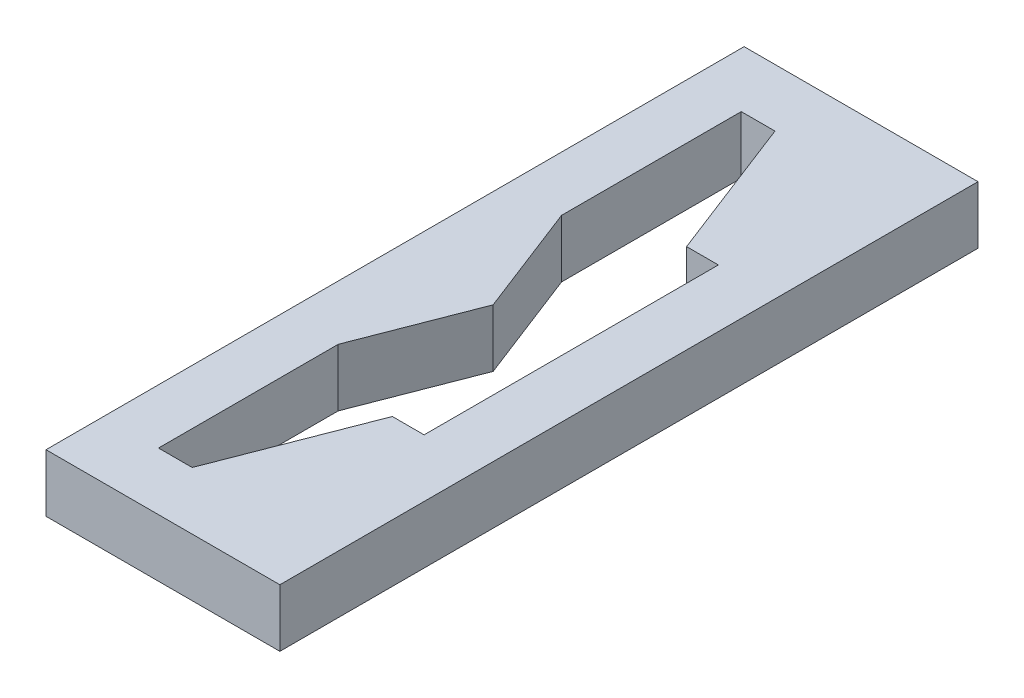
ISO-10303-21;
HEADER;
FILE_DESCRIPTION(('STEP AP214'),'2;1');
FILE_NAME('part.step','',(''),(''),'','','');
FILE_SCHEMA(('AUTOMOTIVE_DESIGN { 1 0 10303 214 1 1 1 1 }'));
ENDSEC;
DATA;
#1=APPLICATION_CONTEXT('core data for automotive mechanical design processes');
#2=APPLICATION_PROTOCOL_DEFINITION('international standard','automotive_design',2000,#1);
#3=PRODUCT_CONTEXT('',#1,'mechanical');
#4=PRODUCT('Part','Part','',(#3));
#5=PRODUCT_RELATED_PRODUCT_CATEGORY('part','',(#4));
#6=PRODUCT_DEFINITION_FORMATION('','',#4);
#7=PRODUCT_DEFINITION_CONTEXT('part definition',#1,'design');
#8=PRODUCT_DEFINITION('design','',#6,#7);
#9=PRODUCT_DEFINITION_SHAPE('','',#8);
#10=(LENGTH_UNIT() NAMED_UNIT(*) SI_UNIT(.MILLI.,.METRE.));
#11=(NAMED_UNIT(*) PLANE_ANGLE_UNIT() SI_UNIT($,.RADIAN.));
#12=(NAMED_UNIT(*) SI_UNIT($,.STERADIAN.) SOLID_ANGLE_UNIT());
#13=UNCERTAINTY_MEASURE_WITH_UNIT(LENGTH_MEASURE(1.E-05),#10,'distance_accuracy_value','');
#14=(GEOMETRIC_REPRESENTATION_CONTEXT(3) GLOBAL_UNCERTAINTY_ASSIGNED_CONTEXT((#13)) GLOBAL_UNIT_ASSIGNED_CONTEXT((#10,
#11,#12)) REPRESENTATION_CONTEXT('',''));
#15=CARTESIAN_POINT('',(0.,0.,0.));
#16=DIRECTION('',(0.,0.,1.));
#17=DIRECTION('',(1.,0.,0.));
#18=AXIS2_PLACEMENT_3D('',#15,#16,#17);
#19=CARTESIAN_POINT('',(0.,2.,0.));
#20=DIRECTION('',(0.,-1.,0.));
#21=DIRECTION('',(0.,0.,-1.));
#22=AXIS2_PLACEMENT_3D('',#19,#20,#21);
#23=PLANE('',#22);
#24=DIRECTION('',(0.,0.,-1.));
#25=VECTOR('',#24,1.);
#26=CARTESIAN_POINT('',(6.10693693693693,2.,22.1));
#27=LINE('',#26,#25);
#28=CARTESIAN_POINT('',(6.10693693693693,2.,22.1));
#29=VERTEX_POINT('',#28);
#30=CARTESIAN_POINT('',(6.10693693693693,2.,-2.1));
#31=VERTEX_POINT('',#30);
#32=EDGE_CURVE('E266',#29,#31,#27,.T.);
#33=ORIENTED_EDGE('',*,*,#32,.T.);
#34=DIRECTION('',(-1.,0.,0.));
#35=VECTOR('',#34,1.);
#36=CARTESIAN_POINT('',(-2.,2.,-2.1));
#37=LINE('',#36,#35);
#38=CARTESIAN_POINT('',(-2.,2.,-2.1));
#39=VERTEX_POINT('',#38);
#40=EDGE_CURVE('E270',#31,#39,#37,.T.);
#41=ORIENTED_EDGE('',*,*,#40,.T.);
#42=DIRECTION('',(0.,0.,1.));
#43=VECTOR('',#42,1.);
#44=CARTESIAN_POINT('',(-2.,2.,22.1));
#45=LINE('',#44,#43);
#46=CARTESIAN_POINT('',(-2.,2.,22.1));
#47=VERTEX_POINT('',#46);
#48=EDGE_CURVE('E274',#39,#47,#45,.T.);
#49=ORIENTED_EDGE('',*,*,#48,.T.);
#50=DIRECTION('',(1.,0.,0.));
#51=VECTOR('',#50,1.);
#52=CARTESIAN_POINT('',(-2.,2.,22.1));
#53=LINE('',#52,#51);
#54=EDGE_CURVE('E277',#47,#29,#53,.T.);
#55=ORIENTED_EDGE('',*,*,#54,.T.);
#56=EDGE_LOOP('',(#33,#41,#49,#55));
#57=FACE_BOUND('',#56,.T.);
#58=DIRECTION('',(0.,0.,1.));
#59=VECTOR('',#58,1.);
#60=CARTESIAN_POINT('',(-0.1,2.,20.1));
#61=LINE('',#60,#59);
#62=CARTESIAN_POINT('',(-0.1,2.,13.871307420652));
#63=VERTEX_POINT('',#62);
#64=CARTESIAN_POINT('',(-0.1,2.,20.1));
#65=VERTEX_POINT('',#64);
#66=EDGE_CURVE('E147',#63,#65,#61,.T.);
#67=ORIENTED_EDGE('',*,*,#66,.F.);
#68=DIRECTION('',(-0.361229766559196,0.,0.932476839257463));
#69=VECTOR('',#68,1.);
#70=CARTESIAN_POINT('',(-0.1,2.,13.871307420652));
#71=LINE('',#70,#69);
#72=CARTESIAN_POINT('',(1.3996956674598,2.,10.));
#73=VERTEX_POINT('',#72);
#74=EDGE_CURVE('E197',#73,#63,#71,.T.);
#75=ORIENTED_EDGE('',*,*,#74,.F.);
#76=DIRECTION('',(0.361229766559196,0.,0.932476839257463));
#77=VECTOR('',#76,1.);
#78=CARTESIAN_POINT('',(-0.1,2.,6.12869257934796));
#79=LINE('',#78,#77);
#80=CARTESIAN_POINT('',(-0.1,2.,6.12869257934796));
#81=VERTEX_POINT('',#80);
#82=EDGE_CURVE('E194',#81,#73,#79,.T.);
#83=ORIENTED_EDGE('',*,*,#82,.F.);
#84=DIRECTION('',(0.,0.,1.));
#85=VECTOR('',#84,1.);
#86=CARTESIAN_POINT('',(-0.1,2.,-0.1));
#87=LINE('',#86,#85);
#88=CARTESIAN_POINT('',(-0.1,2.,-0.1));
#89=VERTEX_POINT('',#88);
#90=EDGE_CURVE('E191',#89,#81,#87,.T.);
#91=ORIENTED_EDGE('',*,*,#90,.F.);
#92=DIRECTION('',(-1.,0.,0.));
#93=VECTOR('',#92,1.);
#94=CARTESIAN_POINT('',(1.0685025307384,2.,-0.1));
#95=LINE('',#94,#93);
#96=CARTESIAN_POINT('',(1.0685025307384,2.,-0.1));
#97=VERTEX_POINT('',#96);
#98=EDGE_CURVE('E188',#97,#89,#95,.T.);
#99=ORIENTED_EDGE('',*,*,#98,.F.);
#100=DIRECTION('',(-0.361229766559197,0.,-0.932476839257463));
#101=VECTOR('',#100,1.);
#102=CARTESIAN_POINT('',(3.00543946767533,2.,4.9));
#103=LINE('',#102,#101);
#104=CARTESIAN_POINT('',(3.00543946767533,2.,4.9));
#105=VERTEX_POINT('',#104);
#106=EDGE_CURVE('E185',#105,#97,#103,.T.);
#107=ORIENTED_EDGE('',*,*,#106,.F.);
#108=DIRECTION('',(-1.,0.,0.));
#109=VECTOR('',#108,1.);
#110=CARTESIAN_POINT('',(4.10693693693694,2.,4.9));
#111=LINE('',#110,#109);
#112=CARTESIAN_POINT('',(4.10693693693694,2.,4.9));
#113=VERTEX_POINT('',#112);
#114=EDGE_CURVE('E182',#113,#105,#111,.T.);
#115=ORIENTED_EDGE('',*,*,#114,.F.);
#116=DIRECTION('',(0.,0.,-1.));
#117=VECTOR('',#116,1.);
#118=CARTESIAN_POINT('',(4.10693693693694,2.,15.1));
#119=LINE('',#118,#117);
#120=CARTESIAN_POINT('',(4.10693693693694,2.,15.1));
#121=VERTEX_POINT('',#120);
#122=EDGE_CURVE('E179',#121,#113,#119,.T.);
#123=ORIENTED_EDGE('',*,*,#122,.F.);
#124=DIRECTION('',(1.,0.,0.));
#125=VECTOR('',#124,1.);
#126=CARTESIAN_POINT('',(4.10693693693694,2.,15.1));
#127=LINE('',#126,#125);
#128=CARTESIAN_POINT('',(3.00543946767533,2.,15.1));
#129=VERTEX_POINT('',#128);
#130=EDGE_CURVE('E174',#129,#121,#127,.T.);
#131=ORIENTED_EDGE('',*,*,#130,.F.);
#132=DIRECTION('',(0.361229766559197,0.,-0.932476839257463));
#133=VECTOR('',#132,1.);
#134=CARTESIAN_POINT('',(3.00543946767533,2.,15.1));
#135=LINE('',#134,#133);
#136=CARTESIAN_POINT('',(1.0685025307384,2.,20.1));
#137=VERTEX_POINT('',#136);
#138=EDGE_CURVE('E170',#137,#129,#135,.T.);
#139=ORIENTED_EDGE('',*,*,#138,.F.);
#140=DIRECTION('',(1.,0.,0.));
#141=VECTOR('',#140,1.);
#142=CARTESIAN_POINT('',(1.0685025307384,2.,20.1));
#143=LINE('',#142,#141);
#144=EDGE_CURVE('E156',#65,#137,#143,.T.);
#145=ORIENTED_EDGE('',*,*,#144,.F.);
#146=EDGE_LOOP('',(#67,#75,#83,#91,#99,#107,#115,#123,#131,#139,#145));
#147=FACE_BOUND('',#146,.T.);
#148=ADVANCED_FACE('F39',(#57,#147),#23,.F.);
#149=CARTESIAN_POINT('',(0.,0.,0.));
#150=DIRECTION('',(0.,-1.,0.));
#151=DIRECTION('',(0.,0.,-1.));
#152=AXIS2_PLACEMENT_3D('',#149,#150,#151);
#153=PLANE('',#152);
#154=DIRECTION('',(0.,0.,-1.));
#155=VECTOR('',#154,1.);
#156=CARTESIAN_POINT('',(6.10693693693693,0.,22.1));
#157=LINE('',#156,#155);
#158=CARTESIAN_POINT('',(6.10693693693693,0.,22.1));
#159=VERTEX_POINT('',#158);
#160=CARTESIAN_POINT('',(6.10693693693693,0.,-2.1));
#161=VERTEX_POINT('',#160);
#162=EDGE_CURVE('E165',#159,#161,#157,.T.);
#163=ORIENTED_EDGE('',*,*,#162,.F.);
#164=DIRECTION('',(1.,0.,0.));
#165=VECTOR('',#164,1.);
#166=CARTESIAN_POINT('',(-2.,0.,22.1));
#167=LINE('',#166,#165);
#168=CARTESIAN_POINT('',(-2.,0.,22.1));
#169=VERTEX_POINT('',#168);
#170=EDGE_CURVE('E271',#169,#159,#167,.T.);
#171=ORIENTED_EDGE('',*,*,#170,.F.);
#172=DIRECTION('',(0.,0.,1.));
#173=VECTOR('',#172,1.);
#174=CARTESIAN_POINT('',(-2.,0.,22.1));
#175=LINE('',#174,#173);
#176=CARTESIAN_POINT('',(-2.,0.,-2.1));
#177=VERTEX_POINT('',#176);
#178=EDGE_CURVE('E287',#177,#169,#175,.T.);
#179=ORIENTED_EDGE('',*,*,#178,.F.);
#180=DIRECTION('',(-1.,0.,0.));
#181=VECTOR('',#180,1.);
#182=CARTESIAN_POINT('',(-2.,0.,-2.1));
#183=LINE('',#182,#181);
#184=EDGE_CURVE('E284',#161,#177,#183,.T.);
#185=ORIENTED_EDGE('',*,*,#184,.F.);
#186=EDGE_LOOP('',(#163,#171,#179,#185));
#187=FACE_BOUND('',#186,.T.);
#188=DIRECTION('',(-0.361229766559196,0.,0.932476839257463));
#189=VECTOR('',#188,1.);
#190=CARTESIAN_POINT('',(-0.1,0.,13.871307420652));
#191=LINE('',#190,#189);
#192=CARTESIAN_POINT('',(1.3996956674598,0.,10.));
#193=VERTEX_POINT('',#192);
#194=CARTESIAN_POINT('',(-0.1,0.,13.871307420652));
#195=VERTEX_POINT('',#194);
#196=EDGE_CURVE('E157',#193,#195,#191,.T.);
#197=ORIENTED_EDGE('',*,*,#196,.T.);
#198=DIRECTION('',(0.,0.,1.));
#199=VECTOR('',#198,1.);
#200=CARTESIAN_POINT('',(-0.1,0.,20.1));
#201=LINE('',#200,#199);
#202=CARTESIAN_POINT('',(-0.1,0.,20.1));
#203=VERTEX_POINT('',#202);
#204=EDGE_CURVE('E63',#195,#203,#201,.T.);
#205=ORIENTED_EDGE('',*,*,#204,.T.);
#206=DIRECTION('',(1.,0.,0.));
#207=VECTOR('',#206,1.);
#208=CARTESIAN_POINT('',(1.0685025307384,0.,20.1));
#209=LINE('',#208,#207);
#210=CARTESIAN_POINT('',(1.0685025307384,0.,20.1));
#211=VERTEX_POINT('',#210);
#212=EDGE_CURVE('E163',#203,#211,#209,.T.);
#213=ORIENTED_EDGE('',*,*,#212,.T.);
#214=DIRECTION('',(0.361229766559197,0.,-0.932476839257463));
#215=VECTOR('',#214,1.);
#216=CARTESIAN_POINT('',(3.00543946767533,0.,15.1));
#217=LINE('',#216,#215);
#218=CARTESIAN_POINT('',(3.00543946767533,0.,15.1));
#219=VERTEX_POINT('',#218);
#220=EDGE_CURVE('E204',#211,#219,#217,.T.);
#221=ORIENTED_EDGE('',*,*,#220,.T.);
#222=DIRECTION('',(1.,0.,0.));
#223=VECTOR('',#222,1.);
#224=CARTESIAN_POINT('',(4.10693693693694,0.,15.1));
#225=LINE('',#224,#223);
#226=CARTESIAN_POINT('',(4.10693693693694,0.,15.1));
#227=VERTEX_POINT('',#226);
#228=EDGE_CURVE('E208',#219,#227,#225,.T.);
#229=ORIENTED_EDGE('',*,*,#228,.T.);
#230=DIRECTION('',(0.,0.,-1.));
#231=VECTOR('',#230,1.);
#232=CARTESIAN_POINT('',(4.10693693693694,0.,15.1));
#233=LINE('',#232,#231);
#234=CARTESIAN_POINT('',(4.10693693693694,0.,4.9));
#235=VERTEX_POINT('',#234);
#236=EDGE_CURVE('E212',#227,#235,#233,.T.);
#237=ORIENTED_EDGE('',*,*,#236,.T.);
#238=DIRECTION('',(-1.,0.,0.));
#239=VECTOR('',#238,1.);
#240=CARTESIAN_POINT('',(4.10693693693694,0.,4.9));
#241=LINE('',#240,#239);
#242=CARTESIAN_POINT('',(3.00543946767533,0.,4.9));
#243=VERTEX_POINT('',#242);
#244=EDGE_CURVE('E216',#235,#243,#241,.T.);
#245=ORIENTED_EDGE('',*,*,#244,.T.);
#246=DIRECTION('',(-0.361229766559197,0.,-0.932476839257463));
#247=VECTOR('',#246,1.);
#248=CARTESIAN_POINT('',(3.00543946767533,0.,4.9));
#249=LINE('',#248,#247);
#250=CARTESIAN_POINT('',(1.0685025307384,0.,-0.1));
#251=VERTEX_POINT('',#250);
#252=EDGE_CURVE('E220',#243,#251,#249,.T.);
#253=ORIENTED_EDGE('',*,*,#252,.T.);
#254=DIRECTION('',(-1.,0.,0.));
#255=VECTOR('',#254,1.);
#256=CARTESIAN_POINT('',(1.0685025307384,0.,-0.1));
#257=LINE('',#256,#255);
#258=CARTESIAN_POINT('',(-0.1,0.,-0.1));
#259=VERTEX_POINT('',#258);
#260=EDGE_CURVE('E224',#251,#259,#257,.T.);
#261=ORIENTED_EDGE('',*,*,#260,.T.);
#262=DIRECTION('',(0.,0.,1.));
#263=VECTOR('',#262,1.);
#264=CARTESIAN_POINT('',(-0.1,0.,-0.1));
#265=LINE('',#264,#263);
#266=CARTESIAN_POINT('',(-0.1,0.,6.12869257934796));
#267=VERTEX_POINT('',#266);
#268=EDGE_CURVE('E228',#259,#267,#265,.T.);
#269=ORIENTED_EDGE('',*,*,#268,.T.);
#270=DIRECTION('',(0.361229766559196,0.,0.932476839257463));
#271=VECTOR('',#270,1.);
#272=CARTESIAN_POINT('',(-0.1,0.,6.12869257934796));
#273=LINE('',#272,#271);
#274=EDGE_CURVE('E232',#267,#193,#273,.T.);
#275=ORIENTED_EDGE('',*,*,#274,.T.);
#276=EDGE_LOOP('',(#197,#205,#213,#221,#229,#237,#245,#253,#261,#269,#275));
#277=FACE_BOUND('',#276,.T.);
#278=ADVANCED_FACE('F310',(#187,#277),#153,.T.);
#279=CARTESIAN_POINT('',(6.10693693693693,2.,22.1));
#280=DIRECTION('',(-1.,0.,0.));
#281=DIRECTION('',(0.,0.,1.));
#282=AXIS2_PLACEMENT_3D('',#279,#280,#281);
#283=PLANE('',#282);
#284=ORIENTED_EDGE('',*,*,#162,.T.);
#285=DIRECTION('',(0.,-1.,0.));
#286=VECTOR('',#285,1.);
#287=CARTESIAN_POINT('',(6.10693693693693,2.,-2.1));
#288=LINE('',#287,#286);
#289=EDGE_CURVE('E11',#31,#161,#288,.T.);
#290=ORIENTED_EDGE('',*,*,#289,.F.);
#291=ORIENTED_EDGE('',*,*,#32,.F.);
#292=DIRECTION('',(0.,-1.,0.));
#293=VECTOR('',#292,1.);
#294=CARTESIAN_POINT('',(6.10693693693693,2.,22.1));
#295=LINE('',#294,#293);
#296=EDGE_CURVE('E280',#29,#159,#295,.T.);
#297=ORIENTED_EDGE('',*,*,#296,.T.);
#298=EDGE_LOOP('',(#284,#290,#291,#297));
#299=FACE_BOUND('',#298,.T.);
#300=ADVANCED_FACE('F41',(#299),#283,.F.);
#301=CARTESIAN_POINT('',(-2.,2.,-2.1));
#302=DIRECTION('',(0.,0.,1.));
#303=DIRECTION('',(1.,0.,0.));
#304=AXIS2_PLACEMENT_3D('',#301,#302,#303);
#305=PLANE('',#304);
#306=ORIENTED_EDGE('',*,*,#184,.T.);
#307=DIRECTION('',(0.,-1.,0.));
#308=VECTOR('',#307,1.);
#309=CARTESIAN_POINT('',(-2.,2.,-2.1));
#310=LINE('',#309,#308);
#311=EDGE_CURVE('E48',#39,#177,#310,.T.);
#312=ORIENTED_EDGE('',*,*,#311,.F.);
#313=ORIENTED_EDGE('',*,*,#40,.F.);
#314=ORIENTED_EDGE('',*,*,#289,.T.);
#315=EDGE_LOOP('',(#306,#312,#313,#314));
#316=FACE_BOUND('',#315,.T.);
#317=ADVANCED_FACE('F320',(#316),#305,.F.);
#318=CARTESIAN_POINT('',(-2.,2.,22.1));
#319=DIRECTION('',(1.,0.,0.));
#320=DIRECTION('',(0.,0.,-1.));
#321=AXIS2_PLACEMENT_3D('',#318,#319,#320);
#322=PLANE('',#321);
#323=ORIENTED_EDGE('',*,*,#178,.T.);
#324=DIRECTION('',(0.,-1.,0.));
#325=VECTOR('',#324,1.);
#326=CARTESIAN_POINT('',(-2.,2.,22.1));
#327=LINE('',#326,#325);
#328=EDGE_CURVE('E295',#47,#169,#327,.T.);
#329=ORIENTED_EDGE('',*,*,#328,.F.);
#330=ORIENTED_EDGE('',*,*,#48,.F.);
#331=ORIENTED_EDGE('',*,*,#311,.T.);
#332=EDGE_LOOP('',(#323,#329,#330,#331));
#333=FACE_BOUND('',#332,.T.);
#334=ADVANCED_FACE('F304',(#333),#322,.F.);
#335=CARTESIAN_POINT('',(-2.,2.,22.1));
#336=DIRECTION('',(0.,0.,-1.));
#337=DIRECTION('',(-1.,0.,0.));
#338=AXIS2_PLACEMENT_3D('',#335,#336,#337);
#339=PLANE('',#338);
#340=ORIENTED_EDGE('',*,*,#170,.T.);
#341=ORIENTED_EDGE('',*,*,#296,.F.);
#342=ORIENTED_EDGE('',*,*,#54,.F.);
#343=ORIENTED_EDGE('',*,*,#328,.T.);
#344=EDGE_LOOP('',(#340,#341,#342,#343));
#345=FACE_BOUND('',#344,.T.);
#346=ADVANCED_FACE('F314',(#345),#339,.F.);
#347=CARTESIAN_POINT('',(-0.1,2.,20.1));
#348=DIRECTION('',(1.,0.,0.));
#349=DIRECTION('',(0.,0.,-1.));
#350=AXIS2_PLACEMENT_3D('',#347,#348,#349);
#351=PLANE('',#350);
#352=ORIENTED_EDGE('',*,*,#204,.F.);
#353=DIRECTION('',(0.,-1.,0.));
#354=VECTOR('',#353,1.);
#355=CARTESIAN_POINT('',(-0.1,2.,13.871307420652));
#356=LINE('',#355,#354);
#357=EDGE_CURVE('E151',#63,#195,#356,.T.);
#358=ORIENTED_EDGE('',*,*,#357,.F.);
#359=ORIENTED_EDGE('',*,*,#66,.T.);
#360=DIRECTION('',(0.,-1.,0.));
#361=VECTOR('',#360,1.);
#362=CARTESIAN_POINT('',(-0.1,2.,20.1));
#363=LINE('',#362,#361);
#364=EDGE_CURVE('E150',#65,#203,#363,.T.);
#365=ORIENTED_EDGE('',*,*,#364,.T.);
#366=EDGE_LOOP('',(#352,#358,#359,#365));
#367=FACE_BOUND('',#366,.T.);
#368=ADVANCED_FACE('F149',(#367),#351,.T.);
#369=CARTESIAN_POINT('',(1.0685025307384,2.,20.1));
#370=DIRECTION('',(0.,0.,-1.));
#371=DIRECTION('',(-1.,0.,0.));
#372=AXIS2_PLACEMENT_3D('',#369,#370,#371);
#373=PLANE('',#372);
#374=ORIENTED_EDGE('',*,*,#212,.F.);
#375=ORIENTED_EDGE('',*,*,#364,.F.);
#376=ORIENTED_EDGE('',*,*,#144,.T.);
#377=DIRECTION('',(0.,-1.,0.));
#378=VECTOR('',#377,1.);
#379=CARTESIAN_POINT('',(1.0685025307384,2.,20.1));
#380=LINE('',#379,#378);
#381=EDGE_CURVE('E166',#137,#211,#380,.T.);
#382=ORIENTED_EDGE('',*,*,#381,.T.);
#383=EDGE_LOOP('',(#374,#375,#376,#382));
#384=FACE_BOUND('',#383,.T.);
#385=ADVANCED_FACE('F160',(#384),#373,.T.);
#386=CARTESIAN_POINT('',(3.00543946767533,2.,15.1));
#387=DIRECTION('',(-0.932476839257463,0.,-0.361229766559197));
#388=DIRECTION('',(-0.361229766559197,0.,0.932476839257463));
#389=AXIS2_PLACEMENT_3D('',#386,#387,#388);
#390=PLANE('',#389);
#391=ORIENTED_EDGE('',*,*,#220,.F.);
#392=ORIENTED_EDGE('',*,*,#381,.F.);
#393=ORIENTED_EDGE('',*,*,#138,.T.);
#394=DIRECTION('',(0.,-1.,0.));
#395=VECTOR('',#394,1.);
#396=CARTESIAN_POINT('',(3.00543946767533,2.,15.1));
#397=LINE('',#396,#395);
#398=EDGE_CURVE('E261',#129,#219,#397,.T.);
#399=ORIENTED_EDGE('',*,*,#398,.T.);
#400=EDGE_LOOP('',(#391,#392,#393,#399));
#401=FACE_BOUND('',#400,.T.);
#402=ADVANCED_FACE('F343',(#401),#390,.T.);
#403=CARTESIAN_POINT('',(4.10693693693694,2.,15.1));
#404=DIRECTION('',(0.,0.,-1.));
#405=DIRECTION('',(-1.,0.,0.));
#406=AXIS2_PLACEMENT_3D('',#403,#404,#405);
#407=PLANE('',#406);
#408=ORIENTED_EDGE('',*,*,#228,.F.);
#409=ORIENTED_EDGE('',*,*,#398,.F.);
#410=ORIENTED_EDGE('',*,*,#130,.T.);
#411=DIRECTION('',(0.,-1.,0.));
#412=VECTOR('',#411,1.);
#413=CARTESIAN_POINT('',(4.10693693693694,2.,15.1));
#414=LINE('',#413,#412);
#415=EDGE_CURVE('E258',#121,#227,#414,.T.);
#416=ORIENTED_EDGE('',*,*,#415,.T.);
#417=EDGE_LOOP('',(#408,#409,#410,#416));
#418=FACE_BOUND('',#417,.T.);
#419=ADVANCED_FACE('F347',(#418),#407,.T.);
#420=CARTESIAN_POINT('',(4.10693693693694,2.,15.1));
#421=DIRECTION('',(-1.,0.,0.));
#422=DIRECTION('',(0.,0.,1.));
#423=AXIS2_PLACEMENT_3D('',#420,#421,#422);
#424=PLANE('',#423);
#425=ORIENTED_EDGE('',*,*,#236,.F.);
#426=ORIENTED_EDGE('',*,*,#415,.F.);
#427=ORIENTED_EDGE('',*,*,#122,.T.);
#428=DIRECTION('',(0.,-1.,0.));
#429=VECTOR('',#428,1.);
#430=CARTESIAN_POINT('',(4.10693693693694,2.,4.9));
#431=LINE('',#430,#429);
#432=EDGE_CURVE('E255',#113,#235,#431,.T.);
#433=ORIENTED_EDGE('',*,*,#432,.T.);
#434=EDGE_LOOP('',(#425,#426,#427,#433));
#435=FACE_BOUND('',#434,.T.);
#436=ADVANCED_FACE('F353',(#435),#424,.T.);
#437=CARTESIAN_POINT('',(4.10693693693694,2.,4.9));
#438=DIRECTION('',(0.,0.,1.));
#439=DIRECTION('',(1.,0.,0.));
#440=AXIS2_PLACEMENT_3D('',#437,#438,#439);
#441=PLANE('',#440);
#442=ORIENTED_EDGE('',*,*,#244,.F.);
#443=ORIENTED_EDGE('',*,*,#432,.F.);
#444=ORIENTED_EDGE('',*,*,#114,.T.);
#445=DIRECTION('',(0.,-1.,0.));
#446=VECTOR('',#445,1.);
#447=CARTESIAN_POINT('',(3.00543946767533,2.,4.9));
#448=LINE('',#447,#446);
#449=EDGE_CURVE('E252',#105,#243,#448,.T.);
#450=ORIENTED_EDGE('',*,*,#449,.T.);
#451=EDGE_LOOP('',(#442,#443,#444,#450));
#452=FACE_BOUND('',#451,.T.);
#453=ADVANCED_FACE('F357',(#452),#441,.T.);
#454=CARTESIAN_POINT('',(3.00543946767533,2.,4.9));
#455=DIRECTION('',(-0.932476839257463,0.,0.361229766559197));
#456=DIRECTION('',(0.361229766559197,0.,0.932476839257463));
#457=AXIS2_PLACEMENT_3D('',#454,#455,#456);
#458=PLANE('',#457);
#459=ORIENTED_EDGE('',*,*,#252,.F.);
#460=ORIENTED_EDGE('',*,*,#449,.F.);
#461=ORIENTED_EDGE('',*,*,#106,.T.);
#462=DIRECTION('',(0.,-1.,0.));
#463=VECTOR('',#462,1.);
#464=CARTESIAN_POINT('',(1.0685025307384,2.,-0.1));
#465=LINE('',#464,#463);
#466=EDGE_CURVE('E249',#97,#251,#465,.T.);
#467=ORIENTED_EDGE('',*,*,#466,.T.);
#468=EDGE_LOOP('',(#459,#460,#461,#467));
#469=FACE_BOUND('',#468,.T.);
#470=ADVANCED_FACE('F361',(#469),#458,.T.);
#471=CARTESIAN_POINT('',(1.0685025307384,2.,-0.1));
#472=DIRECTION('',(0.,0.,1.));
#473=DIRECTION('',(1.,0.,0.));
#474=AXIS2_PLACEMENT_3D('',#471,#472,#473);
#475=PLANE('',#474);
#476=ORIENTED_EDGE('',*,*,#260,.F.);
#477=ORIENTED_EDGE('',*,*,#466,.F.);
#478=ORIENTED_EDGE('',*,*,#98,.T.);
#479=DIRECTION('',(0.,-1.,0.));
#480=VECTOR('',#479,1.);
#481=CARTESIAN_POINT('',(-0.1,2.,-0.1));
#482=LINE('',#481,#480);
#483=EDGE_CURVE('E246',#89,#259,#482,.T.);
#484=ORIENTED_EDGE('',*,*,#483,.T.);
#485=EDGE_LOOP('',(#476,#477,#478,#484));
#486=FACE_BOUND('',#485,.T.);
#487=ADVANCED_FACE('F365',(#486),#475,.T.);
#488=CARTESIAN_POINT('',(-0.1,2.,-0.1));
#489=DIRECTION('',(1.,0.,0.));
#490=DIRECTION('',(0.,0.,-1.));
#491=AXIS2_PLACEMENT_3D('',#488,#489,#490);
#492=PLANE('',#491);
#493=ORIENTED_EDGE('',*,*,#268,.F.);
#494=ORIENTED_EDGE('',*,*,#483,.F.);
#495=ORIENTED_EDGE('',*,*,#90,.T.);
#496=DIRECTION('',(0.,-1.,0.));
#497=VECTOR('',#496,1.);
#498=CARTESIAN_POINT('',(-0.1,2.,6.12869257934796));
#499=LINE('',#498,#497);
#500=EDGE_CURVE('E243',#81,#267,#499,.T.);
#501=ORIENTED_EDGE('',*,*,#500,.T.);
#502=EDGE_LOOP('',(#493,#494,#495,#501));
#503=FACE_BOUND('',#502,.T.);
#504=ADVANCED_FACE('F369',(#503),#492,.T.);
#505=CARTESIAN_POINT('',(-0.1,2.,6.12869257934796));
#506=DIRECTION('',(0.932476839257463,0.,-0.361229766559196));
#507=DIRECTION('',(-0.361229766559196,0.,-0.932476839257463));
#508=AXIS2_PLACEMENT_3D('',#505,#506,#507);
#509=PLANE('',#508);
#510=ORIENTED_EDGE('',*,*,#274,.F.);
#511=ORIENTED_EDGE('',*,*,#500,.F.);
#512=ORIENTED_EDGE('',*,*,#82,.T.);
#513=DIRECTION('',(0.,-1.,0.));
#514=VECTOR('',#513,1.);
#515=CARTESIAN_POINT('',(1.3996956674598,2.,10.));
#516=LINE('',#515,#514);
#517=EDGE_CURVE('E55',#73,#193,#516,.T.);
#518=ORIENTED_EDGE('',*,*,#517,.T.);
#519=EDGE_LOOP('',(#510,#511,#512,#518));
#520=FACE_BOUND('',#519,.T.);
#521=ADVANCED_FACE('F373',(#520),#509,.T.);
#522=CARTESIAN_POINT('',(-0.1,2.,13.871307420652));
#523=DIRECTION('',(0.932476839257463,0.,0.361229766559196));
#524=DIRECTION('',(0.361229766559196,0.,-0.932476839257463));
#525=AXIS2_PLACEMENT_3D('',#522,#523,#524);
#526=PLANE('',#525);
#527=ORIENTED_EDGE('',*,*,#196,.F.);
#528=ORIENTED_EDGE('',*,*,#517,.F.);
#529=ORIENTED_EDGE('',*,*,#74,.T.);
#530=ORIENTED_EDGE('',*,*,#357,.T.);
#531=EDGE_LOOP('',(#527,#528,#529,#530));
#532=FACE_BOUND('',#531,.T.);
#533=ADVANCED_FACE('F377',(#532),#526,.T.);
#534=CLOSED_SHELL('',(#148,#278,#300,#317,#334,#346,#368,#385,#402,#419,#436,#453,#470,#487,
#504,#521,#533));
#535=MANIFOLD_SOLID_BREP('B2',#534);
#536=ADVANCED_BREP_SHAPE_REPRESENTATION('',(#18,#535),#14);
#537=SHAPE_DEFINITION_REPRESENTATION(#9,#536);
ENDSEC;
END-ISO-10303-21;
